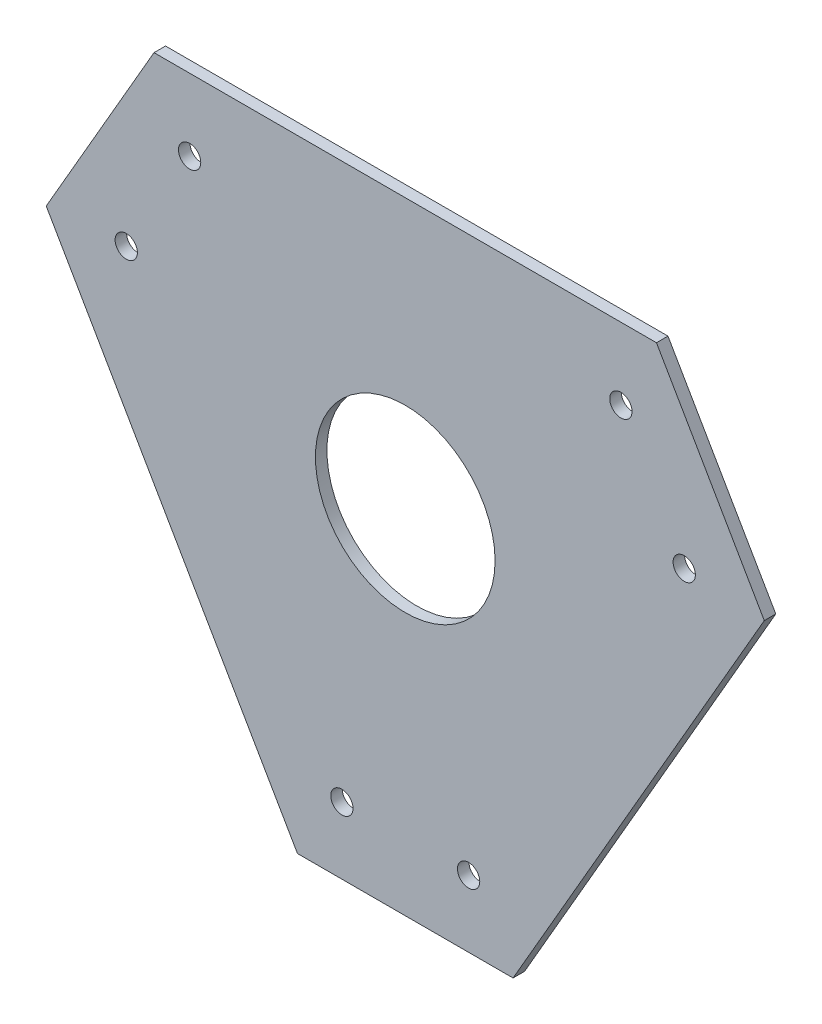
ISO-10303-21;
HEADER;
FILE_DESCRIPTION(('STEP AP214'),'2;1');
FILE_NAME('part.step','',(''),(''),'','','');
FILE_SCHEMA(('AUTOMOTIVE_DESIGN { 1 0 10303 214 1 1 1 1 }'));
ENDSEC;
DATA;
#1=APPLICATION_CONTEXT('core data for automotive mechanical design processes');
#2=APPLICATION_PROTOCOL_DEFINITION('international standard','automotive_design',2000,#1);
#3=PRODUCT_CONTEXT('',#1,'mechanical');
#4=PRODUCT('Part','Part','',(#3));
#5=PRODUCT_RELATED_PRODUCT_CATEGORY('part','',(#4));
#6=PRODUCT_DEFINITION_FORMATION('','',#4);
#7=PRODUCT_DEFINITION_CONTEXT('part definition',#1,'design');
#8=PRODUCT_DEFINITION('design','',#6,#7);
#9=PRODUCT_DEFINITION_SHAPE('','',#8);
#10=(LENGTH_UNIT() NAMED_UNIT(*) SI_UNIT(.MILLI.,.METRE.));
#11=(NAMED_UNIT(*) PLANE_ANGLE_UNIT() SI_UNIT($,.RADIAN.));
#12=(NAMED_UNIT(*) SI_UNIT($,.STERADIAN.) SOLID_ANGLE_UNIT());
#13=UNCERTAINTY_MEASURE_WITH_UNIT(LENGTH_MEASURE(1.E-05),#10,'distance_accuracy_value','');
#14=(GEOMETRIC_REPRESENTATION_CONTEXT(3) GLOBAL_UNCERTAINTY_ASSIGNED_CONTEXT((#13)) GLOBAL_UNIT_ASSIGNED_CONTEXT((#10,
#11,#12)) REPRESENTATION_CONTEXT('',''));
#15=CARTESIAN_POINT('',(0.,0.,0.));
#16=DIRECTION('',(0.,0.,1.));
#17=DIRECTION('',(1.,0.,0.));
#18=AXIS2_PLACEMENT_3D('',#15,#16,#17);
#19=CARTESIAN_POINT('',(0.,-49.0192378864668,1.6));
#20=DIRECTION('',(0.,-1.,0.));
#21=DIRECTION('',(1.,0.,0.));
#22=AXIS2_PLACEMENT_3D('',#19,#20,#21);
#23=PLANE('',#22);
#24=DIRECTION('',(-1.,0.,0.));
#25=VECTOR('',#24,1.);
#26=CARTESIAN_POINT('',(0.,-49.0192378864668,0.));
#27=LINE('',#26,#25);
#28=CARTESIAN_POINT('',(15.,-49.0192378864668,0.));
#29=VERTEX_POINT('',#28);
#30=CARTESIAN_POINT('',(-15.,-49.0192378864668,0.));
#31=VERTEX_POINT('',#30);
#32=EDGE_CURVE('E136',#29,#31,#27,.T.);
#33=ORIENTED_EDGE('',*,*,#32,.F.);
#34=DIRECTION('',(0.,0.,-1.));
#35=VECTOR('',#34,1.);
#36=CARTESIAN_POINT('',(15.,-49.0192378864668,1.6));
#37=LINE('',#36,#35);
#38=CARTESIAN_POINT('',(15.,-49.0192378864668,1.6));
#39=VERTEX_POINT('',#38);
#40=EDGE_CURVE('E11',#39,#29,#37,.T.);
#41=ORIENTED_EDGE('',*,*,#40,.F.);
#42=DIRECTION('',(-1.,0.,0.));
#43=VECTOR('',#42,1.);
#44=CARTESIAN_POINT('',(0.,-49.0192378864668,1.6));
#45=LINE('',#44,#43);
#46=CARTESIAN_POINT('',(-15.,-49.0192378864668,1.6));
#47=VERTEX_POINT('',#46);
#48=EDGE_CURVE('E339',#39,#47,#45,.T.);
#49=ORIENTED_EDGE('',*,*,#48,.T.);
#50=DIRECTION('',(0.,0.,-1.));
#51=VECTOR('',#50,1.);
#52=CARTESIAN_POINT('',(-15.,-49.0192378864668,1.6));
#53=LINE('',#52,#51);
#54=EDGE_CURVE('E50',#47,#31,#53,.T.);
#55=ORIENTED_EDGE('',*,*,#54,.T.);
#56=EDGE_LOOP('',(#33,#41,#49,#55));
#57=FACE_BOUND('',#56,.T.);
#58=ADVANCED_FACE('F33',(#57),#23,.T.);
#59=CARTESIAN_POINT('',(32.4759526419164,-18.75,1.6));
#60=DIRECTION('',(0.866025403784439,-0.5,0.));
#61=DIRECTION('',(0.5,0.866025403784439,0.));
#62=AXIS2_PLACEMENT_3D('',#59,#60,#61);
#63=PLANE('',#62);
#64=DIRECTION('',(-0.5,-0.866025403784439,0.));
#65=VECTOR('',#64,1.);
#66=CARTESIAN_POINT('',(32.4759526419164,-18.75,0.));
#67=LINE('',#66,#65);
#68=CARTESIAN_POINT('',(49.9519052838329,11.5192378864668,0.));
#69=VERTEX_POINT('',#68);
#70=EDGE_CURVE('E138',#69,#29,#67,.T.);
#71=ORIENTED_EDGE('',*,*,#70,.F.);
#72=DIRECTION('',(0.,0.,-1.));
#73=VECTOR('',#72,1.);
#74=CARTESIAN_POINT('',(49.9519052838329,11.5192378864668,1.6));
#75=LINE('',#74,#73);
#76=CARTESIAN_POINT('',(49.9519052838329,11.5192378864668,1.6));
#77=VERTEX_POINT('',#76);
#78=EDGE_CURVE('E42',#77,#69,#75,.T.);
#79=ORIENTED_EDGE('',*,*,#78,.F.);
#80=DIRECTION('',(-0.5,-0.866025403784439,0.));
#81=VECTOR('',#80,1.);
#82=CARTESIAN_POINT('',(32.4759526419164,-18.75,1.6));
#83=LINE('',#82,#81);
#84=EDGE_CURVE('E341',#77,#39,#83,.T.);
#85=ORIENTED_EDGE('',*,*,#84,.T.);
#86=ORIENTED_EDGE('',*,*,#40,.T.);
#87=EDGE_LOOP('',(#71,#79,#85,#86));
#88=FACE_BOUND('',#87,.T.);
#89=ADVANCED_FACE('F159',(#88),#63,.T.);
#90=CARTESIAN_POINT('',(42.4519052838329,24.5096189432334,1.6));
#91=DIRECTION('',(0.866025403784439,0.5,0.));
#92=DIRECTION('',(-0.5,0.866025403784439,0.));
#93=AXIS2_PLACEMENT_3D('',#90,#91,#92);
#94=PLANE('',#93);
#95=DIRECTION('',(0.5,-0.866025403784439,0.));
#96=VECTOR('',#95,1.);
#97=CARTESIAN_POINT('',(42.4519052838329,24.5096189432334,0.));
#98=LINE('',#97,#96);
#99=CARTESIAN_POINT('',(34.9519052838329,37.5,0.));
#100=VERTEX_POINT('',#99);
#101=EDGE_CURVE('E141',#100,#69,#98,.T.);
#102=ORIENTED_EDGE('',*,*,#101,.F.);
#103=DIRECTION('',(0.,0.,-1.));
#104=VECTOR('',#103,1.);
#105=CARTESIAN_POINT('',(34.9519052838329,37.5,1.6));
#106=LINE('',#105,#104);
#107=CARTESIAN_POINT('',(34.9519052838329,37.5,1.6));
#108=VERTEX_POINT('',#107);
#109=EDGE_CURVE('E97',#108,#100,#106,.T.);
#110=ORIENTED_EDGE('',*,*,#109,.F.);
#111=DIRECTION('',(0.5,-0.866025403784439,0.));
#112=VECTOR('',#111,1.);
#113=CARTESIAN_POINT('',(42.4519052838329,24.5096189432334,1.6));
#114=LINE('',#113,#112);
#115=EDGE_CURVE('E107',#108,#77,#114,.T.);
#116=ORIENTED_EDGE('',*,*,#115,.T.);
#117=ORIENTED_EDGE('',*,*,#78,.T.);
#118=EDGE_LOOP('',(#102,#110,#116,#117));
#119=FACE_BOUND('',#118,.T.);
#120=ADVANCED_FACE('F156',(#119),#94,.T.);
#121=CARTESIAN_POINT('',(0.,37.5,1.6));
#122=DIRECTION('',(0.,1.,0.));
#123=DIRECTION('',(0.,0.,1.));
#124=AXIS2_PLACEMENT_3D('',#121,#122,#123);
#125=PLANE('',#124);
#126=DIRECTION('',(1.,0.,0.));
#127=VECTOR('',#126,1.);
#128=CARTESIAN_POINT('',(0.,37.5,0.));
#129=LINE('',#128,#127);
#130=CARTESIAN_POINT('',(-34.9519052838329,37.5,0.));
#131=VERTEX_POINT('',#130);
#132=EDGE_CURVE('E93',#131,#100,#129,.T.);
#133=ORIENTED_EDGE('',*,*,#132,.F.);
#134=DIRECTION('',(0.,0.,-1.));
#135=VECTOR('',#134,1.);
#136=CARTESIAN_POINT('',(-34.9519052838329,37.5,1.6));
#137=LINE('',#136,#135);
#138=CARTESIAN_POINT('',(-34.9519052838329,37.5,1.6));
#139=VERTEX_POINT('',#138);
#140=EDGE_CURVE('E88',#139,#131,#137,.T.);
#141=ORIENTED_EDGE('',*,*,#140,.F.);
#142=DIRECTION('',(1.,0.,0.));
#143=VECTOR('',#142,1.);
#144=CARTESIAN_POINT('',(0.,37.5,1.6));
#145=LINE('',#144,#143);
#146=EDGE_CURVE('E91',#139,#108,#145,.T.);
#147=ORIENTED_EDGE('',*,*,#146,.T.);
#148=ORIENTED_EDGE('',*,*,#109,.T.);
#149=EDGE_LOOP('',(#133,#141,#147,#148));
#150=FACE_BOUND('',#149,.T.);
#151=ADVANCED_FACE('F90',(#150),#125,.T.);
#152=CARTESIAN_POINT('',(-42.4519052838329,24.5096189432334,1.6));
#153=DIRECTION('',(-0.866025403784439,0.5,0.));
#154=DIRECTION('',(-0.5,-0.866025403784439,0.));
#155=AXIS2_PLACEMENT_3D('',#152,#153,#154);
#156=PLANE('',#155);
#157=DIRECTION('',(0.5,0.866025403784439,0.));
#158=VECTOR('',#157,1.);
#159=CARTESIAN_POINT('',(-42.4519052838329,24.5096189432334,0.));
#160=LINE('',#159,#158);
#161=CARTESIAN_POINT('',(-49.9519052838329,11.5192378864668,0.));
#162=VERTEX_POINT('',#161);
#163=EDGE_CURVE('E145',#162,#131,#160,.T.);
#164=ORIENTED_EDGE('',*,*,#163,.F.);
#165=DIRECTION('',(0.,0.,-1.));
#166=VECTOR('',#165,1.);
#167=CARTESIAN_POINT('',(-49.9519052838329,11.5192378864668,1.6));
#168=LINE('',#167,#166);
#169=CARTESIAN_POINT('',(-49.9519052838329,11.5192378864668,1.6));
#170=VERTEX_POINT('',#169);
#171=EDGE_CURVE('E69',#170,#162,#168,.T.);
#172=ORIENTED_EDGE('',*,*,#171,.F.);
#173=DIRECTION('',(0.5,0.866025403784439,0.));
#174=VECTOR('',#173,1.);
#175=CARTESIAN_POINT('',(-42.4519052838329,24.5096189432334,1.6));
#176=LINE('',#175,#174);
#177=EDGE_CURVE('E104',#170,#139,#176,.T.);
#178=ORIENTED_EDGE('',*,*,#177,.T.);
#179=ORIENTED_EDGE('',*,*,#140,.T.);
#180=EDGE_LOOP('',(#164,#172,#178,#179));
#181=FACE_BOUND('',#180,.T.);
#182=ADVANCED_FACE('F109',(#181),#156,.T.);
#183=CARTESIAN_POINT('',(-30.,27.5,1.6));
#184=DIRECTION('',(0.,0.,-1.));
#185=DIRECTION('',(-1.,0.,0.));
#186=AXIS2_PLACEMENT_3D('',#183,#184,#185);
#187=CYLINDRICAL_SURFACE('',#186,1.55);
#188=CARTESIAN_POINT('',(-30.,27.5,1.6));
#189=DIRECTION('',(0.,0.,1.));
#190=DIRECTION('',(1.,0.,0.));
#191=AXIS2_PLACEMENT_3D('',#188,#189,#190);
#192=CIRCLE('',#191,1.55);
#193=CARTESIAN_POINT('',(-28.45,27.5,1.6));
#194=VERTEX_POINT('',#193);
#195=EDGE_CURVE('E336',#194,#194,#192,.T.);
#196=ORIENTED_EDGE('',*,*,#195,.T.);
#197=EDGE_LOOP('',(#196));
#198=FACE_BOUND('',#197,.T.);
#199=CARTESIAN_POINT('',(-30.,27.5,0.));
#200=DIRECTION('',(0.,0.,1.));
#201=DIRECTION('',(1.,0.,0.));
#202=AXIS2_PLACEMENT_3D('',#199,#200,#201);
#203=CIRCLE('',#202,1.55);
#204=CARTESIAN_POINT('',(-28.45,27.5,0.));
#205=VERTEX_POINT('',#204);
#206=EDGE_CURVE('E133',#205,#205,#203,.T.);
#207=ORIENTED_EDGE('',*,*,#206,.F.);
#208=EDGE_LOOP('',(#207));
#209=FACE_BOUND('',#208,.T.);
#210=ADVANCED_FACE('F183',(#198,#209),#187,.F.);
#211=CARTESIAN_POINT('',(30.,27.5,1.6));
#212=DIRECTION('',(0.,0.,-1.));
#213=DIRECTION('',(-1.,0.,0.));
#214=AXIS2_PLACEMENT_3D('',#211,#212,#213);
#215=CYLINDRICAL_SURFACE('',#214,1.55);
#216=CARTESIAN_POINT('',(30.,27.5,1.6));
#217=DIRECTION('',(0.,0.,1.));
#218=DIRECTION('',(1.,0.,0.));
#219=AXIS2_PLACEMENT_3D('',#216,#217,#218);
#220=CIRCLE('',#219,1.55);
#221=CARTESIAN_POINT('',(31.55,27.5,1.6));
#222=VERTEX_POINT('',#221);
#223=EDGE_CURVE('E333',#222,#222,#220,.T.);
#224=ORIENTED_EDGE('',*,*,#223,.T.);
#225=EDGE_LOOP('',(#224));
#226=FACE_BOUND('',#225,.T.);
#227=CARTESIAN_POINT('',(30.,27.5,0.));
#228=DIRECTION('',(0.,0.,1.));
#229=DIRECTION('',(1.,0.,0.));
#230=AXIS2_PLACEMENT_3D('',#227,#228,#229);
#231=CIRCLE('',#230,1.55);
#232=CARTESIAN_POINT('',(31.55,27.5,0.));
#233=VERTEX_POINT('',#232);
#234=EDGE_CURVE('E130',#233,#233,#231,.T.);
#235=ORIENTED_EDGE('',*,*,#234,.F.);
#236=EDGE_LOOP('',(#235));
#237=FACE_BOUND('',#236,.T.);
#238=ADVANCED_FACE('F186',(#226,#237),#215,.F.);
#239=CARTESIAN_POINT('',(38.8156986040721,12.2307621135331,1.6));
#240=DIRECTION('',(0.,0.,-1.));
#241=DIRECTION('',(-1.,0.,0.));
#242=AXIS2_PLACEMENT_3D('',#239,#240,#241);
#243=CYLINDRICAL_SURFACE('',#242,1.55);
#244=CARTESIAN_POINT('',(38.8156986040721,12.2307621135331,1.6));
#245=DIRECTION('',(0.,0.,1.));
#246=DIRECTION('',(1.,0.,0.));
#247=AXIS2_PLACEMENT_3D('',#244,#245,#246);
#248=CIRCLE('',#247,1.55);
#249=CARTESIAN_POINT('',(40.3656986040721,12.2307621135331,1.6));
#250=VERTEX_POINT('',#249);
#251=EDGE_CURVE('E330',#250,#250,#248,.T.);
#252=ORIENTED_EDGE('',*,*,#251,.T.);
#253=EDGE_LOOP('',(#252));
#254=FACE_BOUND('',#253,.T.);
#255=CARTESIAN_POINT('',(38.8156986040721,12.2307621135331,0.));
#256=DIRECTION('',(0.,0.,1.));
#257=DIRECTION('',(1.,0.,0.));
#258=AXIS2_PLACEMENT_3D('',#255,#256,#257);
#259=CIRCLE('',#258,1.55);
#260=CARTESIAN_POINT('',(40.3656986040721,12.2307621135331,0.));
#261=VERTEX_POINT('',#260);
#262=EDGE_CURVE('E127',#261,#261,#259,.T.);
#263=ORIENTED_EDGE('',*,*,#262,.F.);
#264=EDGE_LOOP('',(#263));
#265=FACE_BOUND('',#264,.T.);
#266=ADVANCED_FACE('F190',(#254,#265),#243,.F.);
#267=CARTESIAN_POINT('',(8.81569860407206,-39.7307621135332,1.6));
#268=DIRECTION('',(0.,0.,-1.));
#269=DIRECTION('',(-1.,0.,0.));
#270=AXIS2_PLACEMENT_3D('',#267,#268,#269);
#271=CYLINDRICAL_SURFACE('',#270,1.55);
#272=CARTESIAN_POINT('',(8.81569860407206,-39.7307621135332,1.6));
#273=DIRECTION('',(0.,0.,1.));
#274=DIRECTION('',(1.,0.,0.));
#275=AXIS2_PLACEMENT_3D('',#272,#273,#274);
#276=CIRCLE('',#275,1.55);
#277=CARTESIAN_POINT('',(10.3656986040721,-39.7307621135332,1.6));
#278=VERTEX_POINT('',#277);
#279=EDGE_CURVE('E323',#278,#278,#276,.T.);
#280=ORIENTED_EDGE('',*,*,#279,.T.);
#281=EDGE_LOOP('',(#280));
#282=FACE_BOUND('',#281,.T.);
#283=CARTESIAN_POINT('',(8.81569860407206,-39.7307621135332,0.));
#284=DIRECTION('',(0.,0.,1.));
#285=DIRECTION('',(1.,0.,0.));
#286=AXIS2_PLACEMENT_3D('',#283,#284,#285);
#287=CIRCLE('',#286,1.55);
#288=CARTESIAN_POINT('',(10.3656986040721,-39.7307621135332,0.));
#289=VERTEX_POINT('',#288);
#290=EDGE_CURVE('E124',#289,#289,#287,.T.);
#291=ORIENTED_EDGE('',*,*,#290,.F.);
#292=EDGE_LOOP('',(#291));
#293=FACE_BOUND('',#292,.T.);
#294=ADVANCED_FACE('F194',(#282,#293),#271,.F.);
#295=CARTESIAN_POINT('',(-8.81569860407207,-39.7307621135332,1.6));
#296=DIRECTION('',(0.,0.,-1.));
#297=DIRECTION('',(-1.,0.,0.));
#298=AXIS2_PLACEMENT_3D('',#295,#296,#297);
#299=CYLINDRICAL_SURFACE('',#298,1.55);
#300=CARTESIAN_POINT('',(-8.81569860407207,-39.7307621135332,1.6));
#301=DIRECTION('',(0.,0.,1.));
#302=DIRECTION('',(1.,0.,0.));
#303=AXIS2_PLACEMENT_3D('',#300,#301,#302);
#304=CIRCLE('',#303,1.55);
#305=CARTESIAN_POINT('',(-7.26569860407207,-39.7307621135332,1.6));
#306=VERTEX_POINT('',#305);
#307=EDGE_CURVE('E320',#306,#306,#304,.T.);
#308=ORIENTED_EDGE('',*,*,#307,.T.);
#309=EDGE_LOOP('',(#308));
#310=FACE_BOUND('',#309,.T.);
#311=CARTESIAN_POINT('',(-8.81569860407207,-39.7307621135332,0.));
#312=DIRECTION('',(0.,0.,1.));
#313=DIRECTION('',(1.,0.,0.));
#314=AXIS2_PLACEMENT_3D('',#311,#312,#313);
#315=CIRCLE('',#314,1.55);
#316=CARTESIAN_POINT('',(-7.26569860407207,-39.7307621135332,0.));
#317=VERTEX_POINT('',#316);
#318=EDGE_CURVE('E121',#317,#317,#315,.T.);
#319=ORIENTED_EDGE('',*,*,#318,.F.);
#320=EDGE_LOOP('',(#319));
#321=FACE_BOUND('',#320,.T.);
#322=ADVANCED_FACE('F198',(#310,#321),#299,.F.);
#323=CARTESIAN_POINT('',(-38.8156986040721,12.2307621135332,1.6));
#324=DIRECTION('',(0.,0.,-1.));
#325=DIRECTION('',(-1.,0.,0.));
#326=AXIS2_PLACEMENT_3D('',#323,#324,#325);
#327=CYLINDRICAL_SURFACE('',#326,1.55);
#328=CARTESIAN_POINT('',(-38.8156986040721,12.2307621135332,1.6));
#329=DIRECTION('',(0.,0.,1.));
#330=DIRECTION('',(1.,0.,0.));
#331=AXIS2_PLACEMENT_3D('',#328,#329,#330);
#332=CIRCLE('',#331,1.55);
#333=CARTESIAN_POINT('',(-37.2656986040721,12.2307621135332,1.6));
#334=VERTEX_POINT('',#333);
#335=EDGE_CURVE('E209',#334,#334,#332,.T.);
#336=ORIENTED_EDGE('',*,*,#335,.T.);
#337=EDGE_LOOP('',(#336));
#338=FACE_BOUND('',#337,.T.);
#339=CARTESIAN_POINT('',(-38.8156986040721,12.2307621135332,0.));
#340=DIRECTION('',(0.,0.,1.));
#341=DIRECTION('',(1.,0.,0.));
#342=AXIS2_PLACEMENT_3D('',#339,#340,#341);
#343=CIRCLE('',#342,1.55);
#344=CARTESIAN_POINT('',(-37.2656986040721,12.2307621135332,0.));
#345=VERTEX_POINT('',#344);
#346=EDGE_CURVE('E118',#345,#345,#343,.T.);
#347=ORIENTED_EDGE('',*,*,#346,.F.);
#348=EDGE_LOOP('',(#347));
#349=FACE_BOUND('',#348,.T.);
#350=ADVANCED_FACE('F171',(#338,#349),#327,.F.);
#351=CARTESIAN_POINT('',(0.,0.,1.6));
#352=DIRECTION('',(0.,0.,-1.));
#353=DIRECTION('',(-1.,0.,0.));
#354=AXIS2_PLACEMENT_3D('',#351,#352,#353);
#355=CYLINDRICAL_SURFACE('',#354,12.5);
#356=CARTESIAN_POINT('',(0.,0.,1.6));
#357=DIRECTION('',(0.,0.,1.));
#358=DIRECTION('',(1.,0.,0.));
#359=AXIS2_PLACEMENT_3D('',#356,#357,#358);
#360=CIRCLE('',#359,12.5);
#361=CARTESIAN_POINT('',(12.5,0.,1.6));
#362=VERTEX_POINT('',#361);
#363=EDGE_CURVE('E150',#362,#362,#360,.T.);
#364=ORIENTED_EDGE('',*,*,#363,.T.);
#365=EDGE_LOOP('',(#364));
#366=FACE_BOUND('',#365,.T.);
#367=CARTESIAN_POINT('',(0.,0.,0.));
#368=DIRECTION('',(0.,0.,1.));
#369=DIRECTION('',(1.,0.,0.));
#370=AXIS2_PLACEMENT_3D('',#367,#368,#369);
#371=CIRCLE('',#370,12.5);
#372=CARTESIAN_POINT('',(12.5,0.,0.));
#373=VERTEX_POINT('',#372);
#374=EDGE_CURVE('E115',#373,#373,#371,.T.);
#375=ORIENTED_EDGE('',*,*,#374,.F.);
#376=EDGE_LOOP('',(#375));
#377=FACE_BOUND('',#376,.T.);
#378=ADVANCED_FACE('F35',(#366,#377),#355,.F.);
#379=CARTESIAN_POINT('',(-32.4759526419165,-18.75,1.6));
#380=DIRECTION('',(-0.866025403784438,-0.5,0.));
#381=DIRECTION('',(0.5,-0.866025403784439,0.));
#382=AXIS2_PLACEMENT_3D('',#379,#380,#381);
#383=PLANE('',#382);
#384=DIRECTION('',(-0.5,0.866025403784439,0.));
#385=VECTOR('',#384,1.);
#386=CARTESIAN_POINT('',(-32.4759526419165,-18.75,0.));
#387=LINE('',#386,#385);
#388=EDGE_CURVE('E147',#31,#162,#387,.T.);
#389=ORIENTED_EDGE('',*,*,#388,.F.);
#390=ORIENTED_EDGE('',*,*,#54,.F.);
#391=DIRECTION('',(-0.5,0.866025403784439,0.));
#392=VECTOR('',#391,1.);
#393=CARTESIAN_POINT('',(-32.4759526419165,-18.75,1.6));
#394=LINE('',#393,#392);
#395=EDGE_CURVE('E110',#47,#170,#394,.T.);
#396=ORIENTED_EDGE('',*,*,#395,.T.);
#397=ORIENTED_EDGE('',*,*,#171,.T.);
#398=EDGE_LOOP('',(#389,#390,#396,#397));
#399=FACE_BOUND('',#398,.T.);
#400=ADVANCED_FACE('F162',(#399),#383,.T.);
#401=CARTESIAN_POINT('',(0.,0.,1.6));
#402=DIRECTION('',(0.,0.,1.));
#403=DIRECTION('',(1.,0.,0.));
#404=AXIS2_PLACEMENT_3D('',#401,#402,#403);
#405=PLANE('',#404);
#406=ORIENTED_EDGE('',*,*,#363,.F.);
#407=EDGE_LOOP('',(#406));
#408=FACE_BOUND('',#407,.T.);
#409=ORIENTED_EDGE('',*,*,#335,.F.);
#410=EDGE_LOOP('',(#409));
#411=FACE_BOUND('',#410,.T.);
#412=ORIENTED_EDGE('',*,*,#307,.F.);
#413=EDGE_LOOP('',(#412));
#414=FACE_BOUND('',#413,.T.);
#415=ORIENTED_EDGE('',*,*,#279,.F.);
#416=EDGE_LOOP('',(#415));
#417=FACE_BOUND('',#416,.T.);
#418=ORIENTED_EDGE('',*,*,#251,.F.);
#419=EDGE_LOOP('',(#418));
#420=FACE_BOUND('',#419,.T.);
#421=ORIENTED_EDGE('',*,*,#223,.F.);
#422=EDGE_LOOP('',(#421));
#423=FACE_BOUND('',#422,.T.);
#424=ORIENTED_EDGE('',*,*,#195,.F.);
#425=EDGE_LOOP('',(#424));
#426=FACE_BOUND('',#425,.T.);
#427=ORIENTED_EDGE('',*,*,#48,.F.);
#428=ORIENTED_EDGE('',*,*,#84,.F.);
#429=ORIENTED_EDGE('',*,*,#115,.F.);
#430=ORIENTED_EDGE('',*,*,#146,.F.);
#431=ORIENTED_EDGE('',*,*,#177,.F.);
#432=ORIENTED_EDGE('',*,*,#395,.F.);
#433=EDGE_LOOP('',(#427,#428,#429,#430,#431,#432));
#434=FACE_BOUND('',#433,.T.);
#435=ADVANCED_FACE('F102',(#408,#411,#414,#417,#420,#423,#426,#434),#405,.T.);
#436=CARTESIAN_POINT('',(0.,0.,0.));
#437=DIRECTION('',(0.,0.,1.));
#438=DIRECTION('',(1.,0.,0.));
#439=AXIS2_PLACEMENT_3D('',#436,#437,#438);
#440=PLANE('',#439);
#441=ORIENTED_EDGE('',*,*,#374,.T.);
#442=EDGE_LOOP('',(#441));
#443=FACE_BOUND('',#442,.T.);
#444=ORIENTED_EDGE('',*,*,#346,.T.);
#445=EDGE_LOOP('',(#444));
#446=FACE_BOUND('',#445,.T.);
#447=ORIENTED_EDGE('',*,*,#318,.T.);
#448=EDGE_LOOP('',(#447));
#449=FACE_BOUND('',#448,.T.);
#450=ORIENTED_EDGE('',*,*,#290,.T.);
#451=EDGE_LOOP('',(#450));
#452=FACE_BOUND('',#451,.T.);
#453=ORIENTED_EDGE('',*,*,#262,.T.);
#454=EDGE_LOOP('',(#453));
#455=FACE_BOUND('',#454,.T.);
#456=ORIENTED_EDGE('',*,*,#234,.T.);
#457=EDGE_LOOP('',(#456));
#458=FACE_BOUND('',#457,.T.);
#459=ORIENTED_EDGE('',*,*,#206,.T.);
#460=EDGE_LOOP('',(#459));
#461=FACE_BOUND('',#460,.T.);
#462=ORIENTED_EDGE('',*,*,#32,.T.);
#463=ORIENTED_EDGE('',*,*,#388,.T.);
#464=ORIENTED_EDGE('',*,*,#163,.T.);
#465=ORIENTED_EDGE('',*,*,#132,.T.);
#466=ORIENTED_EDGE('',*,*,#101,.T.);
#467=ORIENTED_EDGE('',*,*,#70,.T.);
#468=EDGE_LOOP('',(#462,#463,#464,#465,#466,#467));
#469=FACE_BOUND('',#468,.T.);
#470=ADVANCED_FACE('F161',(#443,#446,#449,#452,#455,#458,#461,#469),#440,.F.);
#471=CLOSED_SHELL('',(#58,#89,#120,#151,#182,#210,#238,#266,#294,#322,#350,#378,#400,#435,#470));
#472=MANIFOLD_SOLID_BREP('B2',#471);
#473=ADVANCED_BREP_SHAPE_REPRESENTATION('',(#18,#472),#14);
#474=SHAPE_DEFINITION_REPRESENTATION(#9,#473);
ENDSEC;
END-ISO-10303-21;
